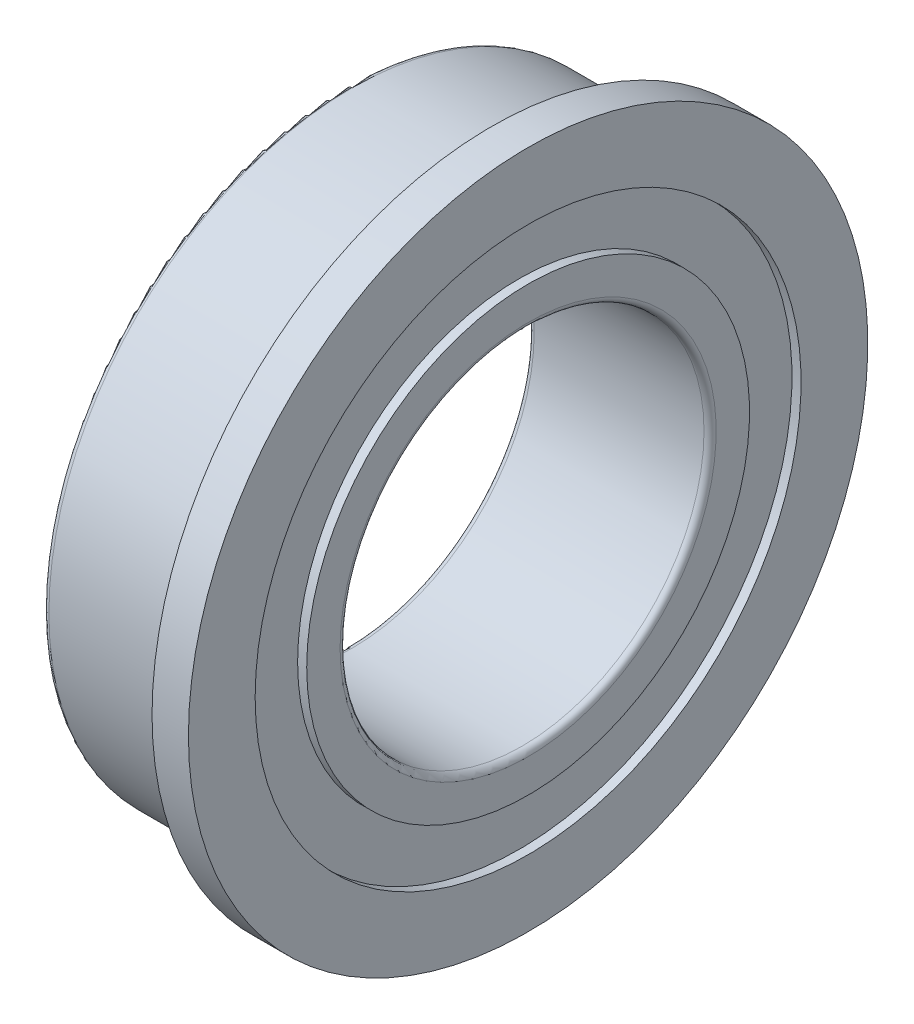
ISO-10303-21;
HEADER;
FILE_DESCRIPTION(('STEP AP214'),'2;1');
FILE_NAME('part.step','',(''),(''),'','','');
FILE_SCHEMA(('AUTOMOTIVE_DESIGN { 1 0 10303 214 1 1 1 1 }'));
ENDSEC;
DATA;
#1=APPLICATION_CONTEXT('core data for automotive mechanical design processes');
#2=APPLICATION_PROTOCOL_DEFINITION('international standard','automotive_design',2000,#1);
#3=PRODUCT_CONTEXT('',#1,'mechanical');
#4=PRODUCT('Part','Part','',(#3));
#5=PRODUCT_RELATED_PRODUCT_CATEGORY('part','',(#4));
#6=PRODUCT_DEFINITION_FORMATION('','',#4);
#7=PRODUCT_DEFINITION_CONTEXT('part definition',#1,'design');
#8=PRODUCT_DEFINITION('design','',#6,#7);
#9=PRODUCT_DEFINITION_SHAPE('','',#8);
#10=(LENGTH_UNIT() NAMED_UNIT(*) SI_UNIT(.MILLI.,.METRE.));
#11=(NAMED_UNIT(*) PLANE_ANGLE_UNIT() SI_UNIT($,.RADIAN.));
#12=(NAMED_UNIT(*) SI_UNIT($,.STERADIAN.) SOLID_ANGLE_UNIT());
#13=UNCERTAINTY_MEASURE_WITH_UNIT(LENGTH_MEASURE(1.E-05),#10,'distance_accuracy_value','');
#14=(GEOMETRIC_REPRESENTATION_CONTEXT(3) GLOBAL_UNCERTAINTY_ASSIGNED_CONTEXT((#13)) GLOBAL_UNIT_ASSIGNED_CONTEXT((#10,
#11,#12)) REPRESENTATION_CONTEXT('',''));
#15=CARTESIAN_POINT('',(0.,0.,0.));
#16=DIRECTION('',(0.,0.,1.));
#17=DIRECTION('',(1.,0.,0.));
#18=AXIS2_PLACEMENT_3D('',#15,#16,#17);
#19=CARTESIAN_POINT('',(-2.55,0.,0.));
#20=DIRECTION('',(-1.,0.,0.));
#21=DIRECTION('',(0.,0.,1.));
#22=AXIS2_PLACEMENT_3D('',#19,#20,#21);
#23=CYLINDRICAL_SURFACE('',#22,5.6);
#24=CARTESIAN_POINT('',(0.,0.,0.));
#25=DIRECTION('',(-1.,0.,0.));
#26=DIRECTION('',(0.,0.,1.));
#27=AXIS2_PLACEMENT_3D('',#24,#25,#26);
#28=CIRCLE('',#27,5.6);
#29=CARTESIAN_POINT('',(0.,0.,5.6));
#30=VERTEX_POINT('',#29);
#31=EDGE_CURVE('E10',#30,#30,#28,.T.);
#32=ORIENTED_EDGE('',*,*,#31,.F.);
#33=EDGE_LOOP('',(#32));
#34=FACE_BOUND('',#33,.T.);
#35=CARTESIAN_POINT('',(0.599999999999999,0.,0.));
#36=DIRECTION('',(-1.,0.,0.));
#37=DIRECTION('',(0.,0.,1.));
#38=AXIS2_PLACEMENT_3D('',#35,#36,#37);
#39=CIRCLE('',#38,5.6);
#40=CARTESIAN_POINT('',(0.599999999999999,0.,5.6));
#41=VERTEX_POINT('',#40);
#42=EDGE_CURVE('E113',#41,#41,#39,.T.);
#43=ORIENTED_EDGE('',*,*,#42,.T.);
#44=EDGE_LOOP('',(#43));
#45=FACE_BOUND('',#44,.T.);
#46=ADVANCED_FACE('F38',(#34,#45),#23,.T.);
#47=CARTESIAN_POINT('',(0.,5.2,0.));
#48=DIRECTION('',(1.,0.,0.));
#49=DIRECTION('',(0.,0.,-1.));
#50=AXIS2_PLACEMENT_3D('',#47,#48,#49);
#51=PLANE('',#50);
#52=CARTESIAN_POINT('',(0.,0.,0.));
#53=DIRECTION('',(-1.,0.,0.));
#54=DIRECTION('',(0.,0.,1.));
#55=AXIS2_PLACEMENT_3D('',#52,#53,#54);
#56=CIRCLE('',#55,5.2);
#57=CARTESIAN_POINT('',(0.,0.,5.2));
#58=VERTEX_POINT('',#57);
#59=EDGE_CURVE('E45',#58,#58,#56,.T.);
#60=ORIENTED_EDGE('',*,*,#59,.F.);
#61=EDGE_LOOP('',(#60));
#62=FACE_BOUND('',#61,.T.);
#63=ORIENTED_EDGE('',*,*,#31,.T.);
#64=EDGE_LOOP('',(#63));
#65=FACE_BOUND('',#64,.T.);
#66=ADVANCED_FACE('F211',(#62,#65),#51,.F.);
#67=CARTESIAN_POINT('',(0.,0.,0.));
#68=DIRECTION('',(-1.,0.,0.));
#69=DIRECTION('',(0.,0.,1.));
#70=AXIS2_PLACEMENT_3D('',#67,#68,#69);
#71=TOROIDAL_SURFACE('',#70,5.,0.199999999999999);
#72=CARTESIAN_POINT('',(-0.199999999999999,0.,0.));
#73=DIRECTION('',(-1.,0.,0.));
#74=DIRECTION('',(0.,0.,1.));
#75=AXIS2_PLACEMENT_3D('',#72,#73,#74);
#76=CIRCLE('',#75,5.);
#77=CARTESIAN_POINT('',(-0.199999999999999,0.,5.));
#78=VERTEX_POINT('',#77);
#79=EDGE_CURVE('E50',#78,#78,#76,.T.);
#80=ORIENTED_EDGE('',*,*,#79,.F.);
#81=EDGE_LOOP('',(#80));
#82=FACE_BOUND('',#81,.T.);
#83=ORIENTED_EDGE('',*,*,#59,.T.);
#84=EDGE_LOOP('',(#83));
#85=FACE_BOUND('',#84,.T.);
#86=ADVANCED_FACE('F206',(#82,#85),#71,.F.);
#87=CARTESIAN_POINT('',(-2.55,0.,0.));
#88=DIRECTION('',(-1.,0.,0.));
#89=DIRECTION('',(0.,0.,1.));
#90=AXIS2_PLACEMENT_3D('',#87,#88,#89);
#91=CYLINDRICAL_SURFACE('',#90,5.);
#92=CARTESIAN_POINT('',(-2.3,0.,0.));
#93=DIRECTION('',(-1.,0.,0.));
#94=DIRECTION('',(0.,0.,1.));
#95=AXIS2_PLACEMENT_3D('',#92,#93,#94);
#96=CIRCLE('',#95,5.);
#97=CARTESIAN_POINT('',(-2.3,0.,5.));
#98=VERTEX_POINT('',#97);
#99=EDGE_CURVE('E55',#98,#98,#96,.T.);
#100=ORIENTED_EDGE('',*,*,#99,.F.);
#101=EDGE_LOOP('',(#100));
#102=FACE_BOUND('',#101,.T.);
#103=ORIENTED_EDGE('',*,*,#79,.T.);
#104=EDGE_LOOP('',(#103));
#105=FACE_BOUND('',#104,.T.);
#106=ADVANCED_FACE('F200',(#102,#105),#91,.T.);
#107=CARTESIAN_POINT('',(-2.3,0.,0.));
#108=DIRECTION('',(-1.,0.,0.));
#109=DIRECTION('',(0.,0.,1.));
#110=AXIS2_PLACEMENT_3D('',#107,#108,#109);
#111=TOROIDAL_SURFACE('',#110,4.9,0.0999999999999998);
#112=CARTESIAN_POINT('',(-2.4,0.,0.));
#113=DIRECTION('',(-1.,0.,0.));
#114=DIRECTION('',(0.,0.,1.));
#115=AXIS2_PLACEMENT_3D('',#112,#113,#114);
#116=CIRCLE('',#115,4.9);
#117=CARTESIAN_POINT('',(-2.4,0.,4.9));
#118=VERTEX_POINT('',#117);
#119=EDGE_CURVE('E61',#118,#118,#116,.T.);
#120=ORIENTED_EDGE('',*,*,#119,.F.);
#121=EDGE_LOOP('',(#120));
#122=FACE_BOUND('',#121,.T.);
#123=ORIENTED_EDGE('',*,*,#99,.T.);
#124=EDGE_LOOP('',(#123));
#125=FACE_BOUND('',#124,.T.);
#126=ADVANCED_FACE('F194',(#122,#125),#111,.T.);
#127=CARTESIAN_POINT('',(-2.4,4.5,0.));
#128=DIRECTION('',(1.,0.,0.));
#129=DIRECTION('',(0.,0.,-1.));
#130=AXIS2_PLACEMENT_3D('',#127,#128,#129);
#131=PLANE('',#130);
#132=CARTESIAN_POINT('',(-2.4,0.,0.));
#133=DIRECTION('',(-1.,0.,0.));
#134=DIRECTION('',(0.,0.,1.));
#135=AXIS2_PLACEMENT_3D('',#132,#133,#134);
#136=CIRCLE('',#135,4.5);
#137=CARTESIAN_POINT('',(-2.4,0.,4.5));
#138=VERTEX_POINT('',#137);
#139=EDGE_CURVE('E65',#138,#138,#136,.T.);
#140=ORIENTED_EDGE('',*,*,#139,.F.);
#141=EDGE_LOOP('',(#140));
#142=FACE_BOUND('',#141,.T.);
#143=ORIENTED_EDGE('',*,*,#119,.T.);
#144=EDGE_LOOP('',(#143));
#145=FACE_BOUND('',#144,.T.);
#146=ADVANCED_FACE('F188',(#142,#145),#131,.F.);
#147=CARTESIAN_POINT('',(-2.55,0.,0.));
#148=DIRECTION('',(-1.,0.,0.));
#149=DIRECTION('',(0.,0.,1.));
#150=AXIS2_PLACEMENT_3D('',#147,#148,#149);
#151=CYLINDRICAL_SURFACE('',#150,4.5);
#152=CARTESIAN_POINT('',(-2.25,0.,0.));
#153=DIRECTION('',(-1.,0.,0.));
#154=DIRECTION('',(0.,0.,1.));
#155=AXIS2_PLACEMENT_3D('',#152,#153,#154);
#156=CIRCLE('',#155,4.5);
#157=CARTESIAN_POINT('',(-2.25,0.,4.5));
#158=VERTEX_POINT('',#157);
#159=EDGE_CURVE('E69',#158,#158,#156,.T.);
#160=ORIENTED_EDGE('',*,*,#159,.F.);
#161=EDGE_LOOP('',(#160));
#162=FACE_BOUND('',#161,.T.);
#163=ORIENTED_EDGE('',*,*,#139,.T.);
#164=EDGE_LOOP('',(#163));
#165=FACE_BOUND('',#164,.T.);
#166=ADVANCED_FACE('F182',(#162,#165),#151,.F.);
#167=CARTESIAN_POINT('',(-2.25,4.5,0.));
#168=DIRECTION('',(1.,0.,0.));
#169=DIRECTION('',(0.,0.,-1.));
#170=AXIS2_PLACEMENT_3D('',#167,#168,#169);
#171=PLANE('',#170);
#172=CARTESIAN_POINT('',(-2.25,0.,0.));
#173=DIRECTION('',(-1.,0.,0.));
#174=DIRECTION('',(0.,0.,1.));
#175=AXIS2_PLACEMENT_3D('',#172,#173,#174);
#176=CIRCLE('',#175,3.65);
#177=CARTESIAN_POINT('',(-2.25,0.,3.65));
#178=VERTEX_POINT('',#177);
#179=EDGE_CURVE('E73',#178,#178,#176,.T.);
#180=ORIENTED_EDGE('',*,*,#179,.F.);
#181=EDGE_LOOP('',(#180));
#182=FACE_BOUND('',#181,.T.);
#183=ORIENTED_EDGE('',*,*,#159,.T.);
#184=EDGE_LOOP('',(#183));
#185=FACE_BOUND('',#184,.T.);
#186=ADVANCED_FACE('F176',(#182,#185),#171,.F.);
#187=CARTESIAN_POINT('',(-2.55,0.,0.));
#188=DIRECTION('',(-1.,0.,0.));
#189=DIRECTION('',(0.,0.,1.));
#190=AXIS2_PLACEMENT_3D('',#187,#188,#189);
#191=CYLINDRICAL_SURFACE('',#190,3.65);
#192=CARTESIAN_POINT('',(-2.4,0.,0.));
#193=DIRECTION('',(-1.,0.,0.));
#194=DIRECTION('',(0.,0.,1.));
#195=AXIS2_PLACEMENT_3D('',#192,#193,#194);
#196=CIRCLE('',#195,3.65);
#197=CARTESIAN_POINT('',(-2.4,0.,3.65));
#198=VERTEX_POINT('',#197);
#199=EDGE_CURVE('E77',#198,#198,#196,.T.);
#200=ORIENTED_EDGE('',*,*,#199,.F.);
#201=EDGE_LOOP('',(#200));
#202=FACE_BOUND('',#201,.T.);
#203=ORIENTED_EDGE('',*,*,#179,.T.);
#204=EDGE_LOOP('',(#203));
#205=FACE_BOUND('',#204,.T.);
#206=ADVANCED_FACE('F170',(#202,#205),#191,.T.);
#207=CARTESIAN_POINT('',(-2.4,3.1,0.));
#208=DIRECTION('',(1.,0.,0.));
#209=DIRECTION('',(0.,0.,-1.));
#210=AXIS2_PLACEMENT_3D('',#207,#208,#209);
#211=PLANE('',#210);
#212=CARTESIAN_POINT('',(-2.4,0.,0.));
#213=DIRECTION('',(-1.,0.,0.));
#214=DIRECTION('',(0.,0.,1.));
#215=AXIS2_PLACEMENT_3D('',#212,#213,#214);
#216=CIRCLE('',#215,3.1);
#217=CARTESIAN_POINT('',(-2.4,0.,3.1));
#218=VERTEX_POINT('',#217);
#219=EDGE_CURVE('E81',#218,#218,#216,.T.);
#220=ORIENTED_EDGE('',*,*,#219,.F.);
#221=EDGE_LOOP('',(#220));
#222=FACE_BOUND('',#221,.T.);
#223=ORIENTED_EDGE('',*,*,#199,.T.);
#224=EDGE_LOOP('',(#223));
#225=FACE_BOUND('',#224,.T.);
#226=ADVANCED_FACE('F164',(#222,#225),#211,.F.);
#227=CARTESIAN_POINT('',(-2.3,0.,0.));
#228=DIRECTION('',(-1.,0.,0.));
#229=DIRECTION('',(0.,0.,1.));
#230=AXIS2_PLACEMENT_3D('',#227,#228,#229);
#231=TOROIDAL_SURFACE('',#230,3.1,0.0999999999999998);
#232=CARTESIAN_POINT('',(-2.3,0.,0.));
#233=DIRECTION('',(-1.,0.,0.));
#234=DIRECTION('',(0.,0.,1.));
#235=AXIS2_PLACEMENT_3D('',#232,#233,#234);
#236=CIRCLE('',#235,3.);
#237=CARTESIAN_POINT('',(-2.3,0.,3.));
#238=VERTEX_POINT('',#237);
#239=EDGE_CURVE('E85',#238,#238,#236,.T.);
#240=ORIENTED_EDGE('',*,*,#239,.F.);
#241=EDGE_LOOP('',(#240));
#242=FACE_BOUND('',#241,.T.);
#243=ORIENTED_EDGE('',*,*,#219,.T.);
#244=EDGE_LOOP('',(#243));
#245=FACE_BOUND('',#244,.T.);
#246=ADVANCED_FACE('F158',(#242,#245),#231,.T.);
#247=CARTESIAN_POINT('',(-2.55,0.,0.));
#248=DIRECTION('',(-1.,0.,0.));
#249=DIRECTION('',(0.,0.,1.));
#250=AXIS2_PLACEMENT_3D('',#247,#248,#249);
#251=CYLINDRICAL_SURFACE('',#250,3.);
#252=CARTESIAN_POINT('',(0.5,0.,0.));
#253=DIRECTION('',(-1.,0.,0.));
#254=DIRECTION('',(0.,0.,1.));
#255=AXIS2_PLACEMENT_3D('',#252,#253,#254);
#256=CIRCLE('',#255,3.);
#257=CARTESIAN_POINT('',(0.5,0.,3.));
#258=VERTEX_POINT('',#257);
#259=EDGE_CURVE('E89',#258,#258,#256,.T.);
#260=ORIENTED_EDGE('',*,*,#259,.F.);
#261=EDGE_LOOP('',(#260));
#262=FACE_BOUND('',#261,.T.);
#263=ORIENTED_EDGE('',*,*,#239,.T.);
#264=EDGE_LOOP('',(#263));
#265=FACE_BOUND('',#264,.T.);
#266=ADVANCED_FACE('F152',(#262,#265),#251,.F.);
#267=CARTESIAN_POINT('',(0.5,0.,0.));
#268=DIRECTION('',(-1.,0.,0.));
#269=DIRECTION('',(0.,0.,1.));
#270=AXIS2_PLACEMENT_3D('',#267,#268,#269);
#271=TOROIDAL_SURFACE('',#270,3.1,0.1);
#272=CARTESIAN_POINT('',(0.6,0.,0.));
#273=DIRECTION('',(-1.,0.,0.));
#274=DIRECTION('',(0.,0.,1.));
#275=AXIS2_PLACEMENT_3D('',#272,#273,#274);
#276=CIRCLE('',#275,3.1);
#277=CARTESIAN_POINT('',(0.6,0.,3.1));
#278=VERTEX_POINT('',#277);
#279=EDGE_CURVE('E93',#278,#278,#276,.T.);
#280=ORIENTED_EDGE('',*,*,#279,.F.);
#281=EDGE_LOOP('',(#280));
#282=FACE_BOUND('',#281,.T.);
#283=ORIENTED_EDGE('',*,*,#259,.T.);
#284=EDGE_LOOP('',(#283));
#285=FACE_BOUND('',#284,.T.);
#286=ADVANCED_FACE('F146',(#282,#285),#271,.T.);
#287=CARTESIAN_POINT('',(0.6,3.65,0.));
#288=DIRECTION('',(-1.,0.,0.));
#289=DIRECTION('',(0.,0.,1.));
#290=AXIS2_PLACEMENT_3D('',#287,#288,#289);
#291=PLANE('',#290);
#292=CARTESIAN_POINT('',(0.6,0.,0.));
#293=DIRECTION('',(-1.,0.,0.));
#294=DIRECTION('',(0.,0.,1.));
#295=AXIS2_PLACEMENT_3D('',#292,#293,#294);
#296=CIRCLE('',#295,3.65);
#297=CARTESIAN_POINT('',(0.6,0.,3.65));
#298=VERTEX_POINT('',#297);
#299=EDGE_CURVE('E97',#298,#298,#296,.T.);
#300=ORIENTED_EDGE('',*,*,#299,.F.);
#301=EDGE_LOOP('',(#300));
#302=FACE_BOUND('',#301,.T.);
#303=ORIENTED_EDGE('',*,*,#279,.T.);
#304=EDGE_LOOP('',(#303));
#305=FACE_BOUND('',#304,.T.);
#306=ADVANCED_FACE('F140',(#302,#305),#291,.F.);
#307=CARTESIAN_POINT('',(-2.55,0.,0.));
#308=DIRECTION('',(-1.,0.,0.));
#309=DIRECTION('',(0.,0.,1.));
#310=AXIS2_PLACEMENT_3D('',#307,#308,#309);
#311=CYLINDRICAL_SURFACE('',#310,3.65);
#312=CARTESIAN_POINT('',(0.449999999999999,0.,0.));
#313=DIRECTION('',(-1.,0.,0.));
#314=DIRECTION('',(0.,0.,1.));
#315=AXIS2_PLACEMENT_3D('',#312,#313,#314);
#316=CIRCLE('',#315,3.65);
#317=CARTESIAN_POINT('',(0.449999999999999,0.,3.65));
#318=VERTEX_POINT('',#317);
#319=EDGE_CURVE('E101',#318,#318,#316,.T.);
#320=ORIENTED_EDGE('',*,*,#319,.F.);
#321=EDGE_LOOP('',(#320));
#322=FACE_BOUND('',#321,.T.);
#323=ORIENTED_EDGE('',*,*,#299,.T.);
#324=EDGE_LOOP('',(#323));
#325=FACE_BOUND('',#324,.T.);
#326=ADVANCED_FACE('F134',(#322,#325),#311,.T.);
#327=CARTESIAN_POINT('',(0.449999999999999,4.5,0.));
#328=DIRECTION('',(-1.,0.,0.));
#329=DIRECTION('',(0.,0.,1.));
#330=AXIS2_PLACEMENT_3D('',#327,#328,#329);
#331=PLANE('',#330);
#332=CARTESIAN_POINT('',(0.449999999999999,0.,0.));
#333=DIRECTION('',(-1.,0.,0.));
#334=DIRECTION('',(0.,0.,1.));
#335=AXIS2_PLACEMENT_3D('',#332,#333,#334);
#336=CIRCLE('',#335,4.5);
#337=CARTESIAN_POINT('',(0.449999999999999,0.,4.5));
#338=VERTEX_POINT('',#337);
#339=EDGE_CURVE('E105',#338,#338,#336,.T.);
#340=ORIENTED_EDGE('',*,*,#339,.F.);
#341=EDGE_LOOP('',(#340));
#342=FACE_BOUND('',#341,.T.);
#343=ORIENTED_EDGE('',*,*,#319,.T.);
#344=EDGE_LOOP('',(#343));
#345=FACE_BOUND('',#344,.T.);
#346=ADVANCED_FACE('F128',(#342,#345),#331,.F.);
#347=CARTESIAN_POINT('',(-2.55,0.,0.));
#348=DIRECTION('',(-1.,0.,0.));
#349=DIRECTION('',(0.,0.,1.));
#350=AXIS2_PLACEMENT_3D('',#347,#348,#349);
#351=CYLINDRICAL_SURFACE('',#350,4.5);
#352=CARTESIAN_POINT('',(0.599999999999999,0.,0.));
#353=DIRECTION('',(-1.,0.,0.));
#354=DIRECTION('',(0.,0.,1.));
#355=AXIS2_PLACEMENT_3D('',#352,#353,#354);
#356=CIRCLE('',#355,4.5);
#357=CARTESIAN_POINT('',(0.599999999999999,0.,4.5));
#358=VERTEX_POINT('',#357);
#359=EDGE_CURVE('E109',#358,#358,#356,.T.);
#360=ORIENTED_EDGE('',*,*,#359,.F.);
#361=EDGE_LOOP('',(#360));
#362=FACE_BOUND('',#361,.T.);
#363=ORIENTED_EDGE('',*,*,#339,.T.);
#364=EDGE_LOOP('',(#363));
#365=FACE_BOUND('',#364,.T.);
#366=ADVANCED_FACE('F122',(#362,#365),#351,.F.);
#367=CARTESIAN_POINT('',(0.599999999999999,5.6,0.));
#368=DIRECTION('',(-1.,0.,0.));
#369=DIRECTION('',(0.,0.,1.));
#370=AXIS2_PLACEMENT_3D('',#367,#368,#369);
#371=PLANE('',#370);
#372=ORIENTED_EDGE('',*,*,#42,.F.);
#373=EDGE_LOOP('',(#372));
#374=FACE_BOUND('',#373,.T.);
#375=ORIENTED_EDGE('',*,*,#359,.T.);
#376=EDGE_LOOP('',(#375));
#377=FACE_BOUND('',#376,.T.);
#378=ADVANCED_FACE('F119',(#374,#377),#371,.F.);
#379=CLOSED_SHELL('',(#46,#66,#86,#106,#126,#146,#166,#186,#206,#226,#246,#266,#286,#306,#326,
#346,#366,#378));
#380=MANIFOLD_SOLID_BREP('B2',#379);
#381=ADVANCED_BREP_SHAPE_REPRESENTATION('',(#18,#380),#14);
#382=SHAPE_DEFINITION_REPRESENTATION(#9,#381);
ENDSEC;
END-ISO-10303-21;
